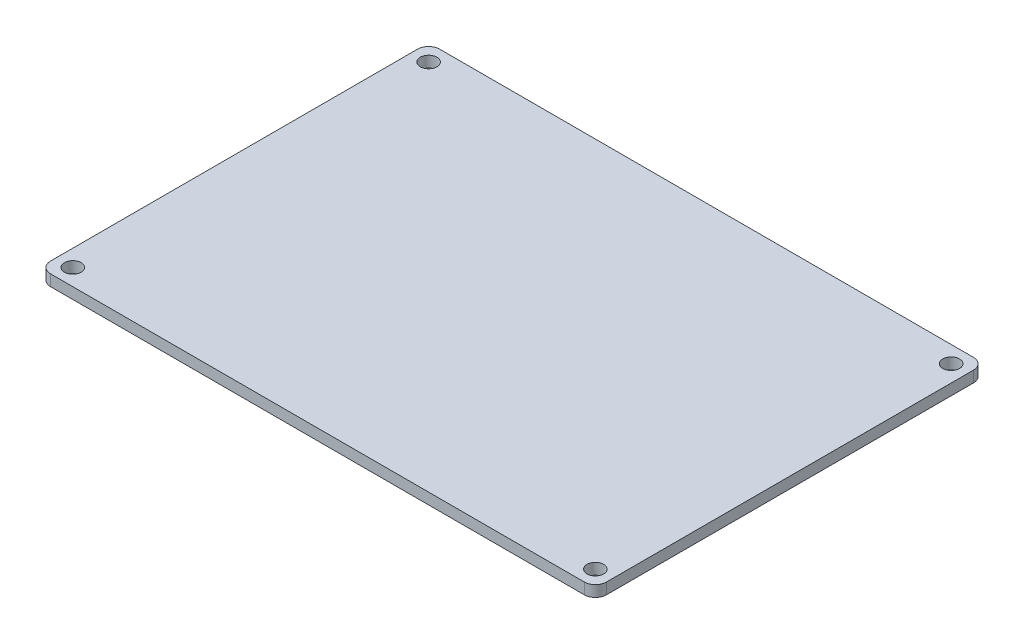
ISO-10303-21;
HEADER;
FILE_DESCRIPTION(('STEP AP214'),'2;1');
FILE_NAME('part.step','',(''),(''),'','','');
FILE_SCHEMA(('AUTOMOTIVE_DESIGN { 1 0 10303 214 1 1 1 1 }'));
ENDSEC;
DATA;
#1=APPLICATION_CONTEXT('core data for automotive mechanical design processes');
#2=APPLICATION_PROTOCOL_DEFINITION('international standard','automotive_design',2000,#1);
#3=PRODUCT_CONTEXT('',#1,'mechanical');
#4=PRODUCT('Part','Part','',(#3));
#5=PRODUCT_RELATED_PRODUCT_CATEGORY('part','',(#4));
#6=PRODUCT_DEFINITION_FORMATION('','',#4);
#7=PRODUCT_DEFINITION_CONTEXT('part definition',#1,'design');
#8=PRODUCT_DEFINITION('design','',#6,#7);
#9=PRODUCT_DEFINITION_SHAPE('','',#8);
#10=(LENGTH_UNIT() NAMED_UNIT(*) SI_UNIT(.MILLI.,.METRE.));
#11=(NAMED_UNIT(*) PLANE_ANGLE_UNIT() SI_UNIT($,.RADIAN.));
#12=(NAMED_UNIT(*) SI_UNIT($,.STERADIAN.) SOLID_ANGLE_UNIT());
#13=UNCERTAINTY_MEASURE_WITH_UNIT(LENGTH_MEASURE(1.E-05),#10,'distance_accuracy_value','');
#14=(GEOMETRIC_REPRESENTATION_CONTEXT(3) GLOBAL_UNCERTAINTY_ASSIGNED_CONTEXT((#13)) GLOBAL_UNIT_ASSIGNED_CONTEXT((#10,
#11,#12)) REPRESENTATION_CONTEXT('',''));
#15=CARTESIAN_POINT('',(0.,0.,0.));
#16=DIRECTION('',(0.,0.,1.));
#17=DIRECTION('',(1.,0.,0.));
#18=AXIS2_PLACEMENT_3D('',#15,#16,#17);
#19=CARTESIAN_POINT('',(48.,2.,-33.));
#20=DIRECTION('',(0.,1.,0.));
#21=DIRECTION('',(0.,0.,1.));
#22=AXIS2_PLACEMENT_3D('',#19,#20,#21);
#23=PLANE('',#22);
#24=CARTESIAN_POINT('',(47.,2.,32.));
#25=DIRECTION('',(0.,1.,0.));
#26=DIRECTION('',(0.,0.,1.));
#27=AXIS2_PLACEMENT_3D('',#24,#25,#26);
#28=CIRCLE('',#27,1.5);
#29=CARTESIAN_POINT('',(47.,2.,33.5));
#30=VERTEX_POINT('',#29);
#31=EDGE_CURVE('E202',#30,#30,#28,.T.);
#32=ORIENTED_EDGE('',*,*,#31,.F.);
#33=EDGE_LOOP('',(#32));
#34=FACE_BOUND('',#33,.T.);
#35=CARTESIAN_POINT('',(-47.,2.,-32.));
#36=DIRECTION('',(0.,1.,0.));
#37=DIRECTION('',(0.,0.,1.));
#38=AXIS2_PLACEMENT_3D('',#35,#36,#37);
#39=CIRCLE('',#38,1.5);
#40=CARTESIAN_POINT('',(-47.,2.,-30.5));
#41=VERTEX_POINT('',#40);
#42=EDGE_CURVE('E148',#41,#41,#39,.T.);
#43=ORIENTED_EDGE('',*,*,#42,.F.);
#44=EDGE_LOOP('',(#43));
#45=FACE_BOUND('',#44,.T.);
#46=CARTESIAN_POINT('',(48.,2.,-33.));
#47=DIRECTION('',(0.,1.,0.));
#48=DIRECTION('',(0.,0.,1.));
#49=AXIS2_PLACEMENT_3D('',#46,#47,#48);
#50=CIRCLE('',#49,2.);
#51=CARTESIAN_POINT('',(50.,2.,-33.));
#52=VERTEX_POINT('',#51);
#53=CARTESIAN_POINT('',(48.,2.,-35.));
#54=VERTEX_POINT('',#53);
#55=EDGE_CURVE('E159',#52,#54,#50,.T.);
#56=ORIENTED_EDGE('',*,*,#55,.T.);
#57=DIRECTION('',(-1.,0.,0.));
#58=VECTOR('',#57,1.);
#59=CARTESIAN_POINT('',(-48.,2.,-35.));
#60=LINE('',#59,#58);
#61=CARTESIAN_POINT('',(-48.,2.,-35.));
#62=VERTEX_POINT('',#61);
#63=EDGE_CURVE('E107',#54,#62,#60,.T.);
#64=ORIENTED_EDGE('',*,*,#63,.T.);
#65=CARTESIAN_POINT('',(-48.,2.,-33.));
#66=DIRECTION('',(0.,1.,0.));
#67=DIRECTION('',(0.,0.,-1.));
#68=AXIS2_PLACEMENT_3D('',#65,#66,#67);
#69=CIRCLE('',#68,2.);
#70=CARTESIAN_POINT('',(-50.,2.,-33.));
#71=VERTEX_POINT('',#70);
#72=EDGE_CURVE('E174',#62,#71,#69,.T.);
#73=ORIENTED_EDGE('',*,*,#72,.T.);
#74=DIRECTION('',(0.,0.,1.));
#75=VECTOR('',#74,1.);
#76=CARTESIAN_POINT('',(-50.,2.,-33.));
#77=LINE('',#76,#75);
#78=CARTESIAN_POINT('',(-50.,2.,33.));
#79=VERTEX_POINT('',#78);
#80=EDGE_CURVE('E187',#71,#79,#77,.T.);
#81=ORIENTED_EDGE('',*,*,#80,.T.);
#82=CARTESIAN_POINT('',(-48.,2.,33.));
#83=DIRECTION('',(0.,1.,0.));
#84=DIRECTION('',(0.,0.,1.));
#85=AXIS2_PLACEMENT_3D('',#82,#83,#84);
#86=CIRCLE('',#85,1.99999999999999);
#87=CARTESIAN_POINT('',(-48.,2.,35.));
#88=VERTEX_POINT('',#87);
#89=EDGE_CURVE('E126',#79,#88,#86,.T.);
#90=ORIENTED_EDGE('',*,*,#89,.T.);
#91=DIRECTION('',(1.,0.,0.));
#92=VECTOR('',#91,1.);
#93=CARTESIAN_POINT('',(-48.,2.,35.));
#94=LINE('',#93,#92);
#95=CARTESIAN_POINT('',(48.,2.,35.));
#96=VERTEX_POINT('',#95);
#97=EDGE_CURVE('E120',#88,#96,#94,.T.);
#98=ORIENTED_EDGE('',*,*,#97,.T.);
#99=CARTESIAN_POINT('',(48.,2.,33.));
#100=DIRECTION('',(0.,1.,0.));
#101=DIRECTION('',(0.,0.,1.));
#102=AXIS2_PLACEMENT_3D('',#99,#100,#101);
#103=CIRCLE('',#102,2.);
#104=CARTESIAN_POINT('',(50.,2.,33.));
#105=VERTEX_POINT('',#104);
#106=EDGE_CURVE('E124',#96,#105,#103,.T.);
#107=ORIENTED_EDGE('',*,*,#106,.T.);
#108=DIRECTION('',(0.,0.,-1.));
#109=VECTOR('',#108,1.);
#110=CARTESIAN_POINT('',(50.,2.,-33.));
#111=LINE('',#110,#109);
#112=EDGE_CURVE('E64',#105,#52,#111,.T.);
#113=ORIENTED_EDGE('',*,*,#112,.T.);
#114=EDGE_LOOP('',(#56,#64,#73,#81,#90,#98,#107,#113));
#115=FACE_BOUND('',#114,.T.);
#116=CARTESIAN_POINT('',(-47.,2.,32.));
#117=DIRECTION('',(0.,1.,0.));
#118=DIRECTION('',(0.,0.,-1.));
#119=AXIS2_PLACEMENT_3D('',#116,#117,#118);
#120=CIRCLE('',#119,1.5);
#121=CARTESIAN_POINT('',(-47.,2.,30.5));
#122=VERTEX_POINT('',#121);
#123=EDGE_CURVE('E196',#122,#122,#120,.T.);
#124=ORIENTED_EDGE('',*,*,#123,.F.);
#125=EDGE_LOOP('',(#124));
#126=FACE_BOUND('',#125,.T.);
#127=CARTESIAN_POINT('',(47.,2.,-32.));
#128=DIRECTION('',(0.,1.,0.));
#129=DIRECTION('',(0.,0.,-1.));
#130=AXIS2_PLACEMENT_3D('',#127,#128,#129);
#131=CIRCLE('',#130,1.5);
#132=CARTESIAN_POINT('',(47.,2.,-33.5));
#133=VERTEX_POINT('',#132);
#134=EDGE_CURVE('E208',#133,#133,#131,.T.);
#135=ORIENTED_EDGE('',*,*,#134,.F.);
#136=EDGE_LOOP('',(#135));
#137=FACE_BOUND('',#136,.T.);
#138=ADVANCED_FACE('F47',(#34,#45,#115,#126,#137),#23,.T.);
#139=CARTESIAN_POINT('',(48.,0.,-33.));
#140=DIRECTION('',(0.,1.,0.));
#141=DIRECTION('',(0.,0.,1.));
#142=AXIS2_PLACEMENT_3D('',#139,#140,#141);
#143=PLANE('',#142);
#144=CARTESIAN_POINT('',(48.,0.,-33.));
#145=DIRECTION('',(0.,1.,0.));
#146=DIRECTION('',(0.,0.,1.));
#147=AXIS2_PLACEMENT_3D('',#144,#145,#146);
#148=CIRCLE('',#147,2.);
#149=CARTESIAN_POINT('',(50.,0.,-33.));
#150=VERTEX_POINT('',#149);
#151=CARTESIAN_POINT('',(48.,0.,-35.));
#152=VERTEX_POINT('',#151);
#153=EDGE_CURVE('E144',#150,#152,#148,.T.);
#154=ORIENTED_EDGE('',*,*,#153,.F.);
#155=DIRECTION('',(0.,0.,-1.));
#156=VECTOR('',#155,1.);
#157=CARTESIAN_POINT('',(50.,0.,-33.));
#158=LINE('',#157,#156);
#159=CARTESIAN_POINT('',(50.,0.,33.));
#160=VERTEX_POINT('',#159);
#161=EDGE_CURVE('E99',#160,#150,#158,.T.);
#162=ORIENTED_EDGE('',*,*,#161,.F.);
#163=CARTESIAN_POINT('',(48.,0.,33.));
#164=DIRECTION('',(0.,1.,0.));
#165=DIRECTION('',(0.,0.,1.));
#166=AXIS2_PLACEMENT_3D('',#163,#164,#165);
#167=CIRCLE('',#166,2.);
#168=CARTESIAN_POINT('',(48.,0.,35.));
#169=VERTEX_POINT('',#168);
#170=EDGE_CURVE('E93',#169,#160,#167,.T.);
#171=ORIENTED_EDGE('',*,*,#170,.F.);
#172=DIRECTION('',(1.,0.,0.));
#173=VECTOR('',#172,1.);
#174=CARTESIAN_POINT('',(-48.,0.,35.));
#175=LINE('',#174,#173);
#176=CARTESIAN_POINT('',(-48.,0.,35.));
#177=VERTEX_POINT('',#176);
#178=EDGE_CURVE('E134',#177,#169,#175,.T.);
#179=ORIENTED_EDGE('',*,*,#178,.F.);
#180=CARTESIAN_POINT('',(-48.,0.,33.));
#181=DIRECTION('',(0.,1.,0.));
#182=DIRECTION('',(0.,0.,1.));
#183=AXIS2_PLACEMENT_3D('',#180,#181,#182);
#184=CIRCLE('',#183,1.99999999999999);
#185=CARTESIAN_POINT('',(-50.,0.,33.));
#186=VERTEX_POINT('',#185);
#187=EDGE_CURVE('E154',#186,#177,#184,.T.);
#188=ORIENTED_EDGE('',*,*,#187,.F.);
#189=DIRECTION('',(0.,0.,1.));
#190=VECTOR('',#189,1.);
#191=CARTESIAN_POINT('',(-50.,0.,-33.));
#192=LINE('',#191,#190);
#193=CARTESIAN_POINT('',(-50.,0.,-33.));
#194=VERTEX_POINT('',#193);
#195=EDGE_CURVE('E152',#194,#186,#192,.T.);
#196=ORIENTED_EDGE('',*,*,#195,.F.);
#197=CARTESIAN_POINT('',(-48.,0.,-33.));
#198=DIRECTION('',(0.,1.,0.));
#199=DIRECTION('',(0.,0.,-1.));
#200=AXIS2_PLACEMENT_3D('',#197,#198,#199);
#201=CIRCLE('',#200,2.);
#202=CARTESIAN_POINT('',(-48.,0.,-35.));
#203=VERTEX_POINT('',#202);
#204=EDGE_CURVE('E150',#203,#194,#201,.T.);
#205=ORIENTED_EDGE('',*,*,#204,.F.);
#206=DIRECTION('',(-1.,0.,0.));
#207=VECTOR('',#206,1.);
#208=CARTESIAN_POINT('',(-48.,0.,-35.));
#209=LINE('',#208,#207);
#210=EDGE_CURVE('E147',#152,#203,#209,.T.);
#211=ORIENTED_EDGE('',*,*,#210,.F.);
#212=EDGE_LOOP('',(#154,#162,#171,#179,#188,#196,#205,#211));
#213=FACE_BOUND('',#212,.T.);
#214=CARTESIAN_POINT('',(47.,0.,32.));
#215=DIRECTION('',(0.,1.,0.));
#216=DIRECTION('',(0.,0.,1.));
#217=AXIS2_PLACEMENT_3D('',#214,#215,#216);
#218=CIRCLE('',#217,1.5);
#219=CARTESIAN_POINT('',(47.,0.,33.5));
#220=VERTEX_POINT('',#219);
#221=EDGE_CURVE('E205',#220,#220,#218,.T.);
#222=ORIENTED_EDGE('',*,*,#221,.T.);
#223=EDGE_LOOP('',(#222));
#224=FACE_BOUND('',#223,.T.);
#225=CARTESIAN_POINT('',(47.,0.,-32.));
#226=DIRECTION('',(0.,1.,0.));
#227=DIRECTION('',(0.,0.,-1.));
#228=AXIS2_PLACEMENT_3D('',#225,#226,#227);
#229=CIRCLE('',#228,1.5);
#230=CARTESIAN_POINT('',(47.,0.,-33.5));
#231=VERTEX_POINT('',#230);
#232=EDGE_CURVE('E211',#231,#231,#229,.T.);
#233=ORIENTED_EDGE('',*,*,#232,.T.);
#234=EDGE_LOOP('',(#233));
#235=FACE_BOUND('',#234,.T.);
#236=CARTESIAN_POINT('',(-47.,0.,-32.));
#237=DIRECTION('',(0.,1.,0.));
#238=DIRECTION('',(0.,0.,1.));
#239=AXIS2_PLACEMENT_3D('',#236,#237,#238);
#240=CIRCLE('',#239,1.5);
#241=CARTESIAN_POINT('',(-47.,0.,-30.5));
#242=VERTEX_POINT('',#241);
#243=EDGE_CURVE('E193',#242,#242,#240,.T.);
#244=ORIENTED_EDGE('',*,*,#243,.T.);
#245=EDGE_LOOP('',(#244));
#246=FACE_BOUND('',#245,.T.);
#247=CARTESIAN_POINT('',(-47.,0.,32.));
#248=DIRECTION('',(0.,1.,0.));
#249=DIRECTION('',(0.,0.,-1.));
#250=AXIS2_PLACEMENT_3D('',#247,#248,#249);
#251=CIRCLE('',#250,1.5);
#252=CARTESIAN_POINT('',(-47.,0.,30.5));
#253=VERTEX_POINT('',#252);
#254=EDGE_CURVE('E199',#253,#253,#251,.T.);
#255=ORIENTED_EDGE('',*,*,#254,.T.);
#256=EDGE_LOOP('',(#255));
#257=FACE_BOUND('',#256,.T.);
#258=ADVANCED_FACE('F178',(#213,#224,#235,#246,#257),#143,.F.);
#259=CARTESIAN_POINT('',(48.,2.,-33.));
#260=DIRECTION('',(0.,-1.,0.));
#261=DIRECTION('',(0.,0.,-1.));
#262=AXIS2_PLACEMENT_3D('',#259,#260,#261);
#263=CYLINDRICAL_SURFACE('',#262,2.);
#264=ORIENTED_EDGE('',*,*,#153,.T.);
#265=DIRECTION('',(0.,-1.,0.));
#266=VECTOR('',#265,1.);
#267=CARTESIAN_POINT('',(48.,2.,-35.));
#268=LINE('',#267,#266);
#269=EDGE_CURVE('E11',#54,#152,#268,.T.);
#270=ORIENTED_EDGE('',*,*,#269,.F.);
#271=ORIENTED_EDGE('',*,*,#55,.F.);
#272=DIRECTION('',(0.,-1.,0.));
#273=VECTOR('',#272,1.);
#274=CARTESIAN_POINT('',(50.,2.,-33.));
#275=LINE('',#274,#273);
#276=EDGE_CURVE('E140',#52,#150,#275,.T.);
#277=ORIENTED_EDGE('',*,*,#276,.T.);
#278=EDGE_LOOP('',(#264,#270,#271,#277));
#279=FACE_BOUND('',#278,.T.);
#280=ADVANCED_FACE('F49',(#279),#263,.T.);
#281=CARTESIAN_POINT('',(-48.,2.,-35.));
#282=DIRECTION('',(0.,0.,1.));
#283=DIRECTION('',(1.,0.,0.));
#284=AXIS2_PLACEMENT_3D('',#281,#282,#283);
#285=PLANE('',#284);
#286=ORIENTED_EDGE('',*,*,#210,.T.);
#287=DIRECTION('',(0.,-1.,0.));
#288=VECTOR('',#287,1.);
#289=CARTESIAN_POINT('',(-48.,2.,-35.));
#290=LINE('',#289,#288);
#291=EDGE_CURVE('E56',#62,#203,#290,.T.);
#292=ORIENTED_EDGE('',*,*,#291,.F.);
#293=ORIENTED_EDGE('',*,*,#63,.F.);
#294=ORIENTED_EDGE('',*,*,#269,.T.);
#295=EDGE_LOOP('',(#286,#292,#293,#294));
#296=FACE_BOUND('',#295,.T.);
#297=ADVANCED_FACE('F246',(#296),#285,.F.);
#298=CARTESIAN_POINT('',(-48.,2.,-33.));
#299=DIRECTION('',(0.,-1.,0.));
#300=DIRECTION('',(0.,0.,-1.));
#301=AXIS2_PLACEMENT_3D('',#298,#299,#300);
#302=CYLINDRICAL_SURFACE('',#301,2.);
#303=ORIENTED_EDGE('',*,*,#204,.T.);
#304=DIRECTION('',(0.,-1.,0.));
#305=VECTOR('',#304,1.);
#306=CARTESIAN_POINT('',(-50.,2.,-33.));
#307=LINE('',#306,#305);
#308=EDGE_CURVE('E166',#71,#194,#307,.T.);
#309=ORIENTED_EDGE('',*,*,#308,.F.);
#310=ORIENTED_EDGE('',*,*,#72,.F.);
#311=ORIENTED_EDGE('',*,*,#291,.T.);
#312=EDGE_LOOP('',(#303,#309,#310,#311));
#313=FACE_BOUND('',#312,.T.);
#314=ADVANCED_FACE('F172',(#313),#302,.T.);
#315=CARTESIAN_POINT('',(-50.,2.,-33.));
#316=DIRECTION('',(1.,0.,0.));
#317=DIRECTION('',(0.,0.,-1.));
#318=AXIS2_PLACEMENT_3D('',#315,#316,#317);
#319=PLANE('',#318);
#320=ORIENTED_EDGE('',*,*,#195,.T.);
#321=DIRECTION('',(0.,-1.,0.));
#322=VECTOR('',#321,1.);
#323=CARTESIAN_POINT('',(-50.,2.,33.));
#324=LINE('',#323,#322);
#325=EDGE_CURVE('E163',#79,#186,#324,.T.);
#326=ORIENTED_EDGE('',*,*,#325,.F.);
#327=ORIENTED_EDGE('',*,*,#80,.F.);
#328=ORIENTED_EDGE('',*,*,#308,.T.);
#329=EDGE_LOOP('',(#320,#326,#327,#328));
#330=FACE_BOUND('',#329,.T.);
#331=ADVANCED_FACE('F183',(#330),#319,.F.);
#332=CARTESIAN_POINT('',(-48.,2.,33.));
#333=DIRECTION('',(0.,-1.,0.));
#334=DIRECTION('',(0.,0.,-1.));
#335=AXIS2_PLACEMENT_3D('',#332,#333,#334);
#336=CYLINDRICAL_SURFACE('',#335,1.99999999999999);
#337=ORIENTED_EDGE('',*,*,#187,.T.);
#338=DIRECTION('',(0.,-1.,0.));
#339=VECTOR('',#338,1.);
#340=CARTESIAN_POINT('',(-48.,2.,35.));
#341=LINE('',#340,#339);
#342=EDGE_CURVE('E135',#88,#177,#341,.T.);
#343=ORIENTED_EDGE('',*,*,#342,.F.);
#344=ORIENTED_EDGE('',*,*,#89,.F.);
#345=ORIENTED_EDGE('',*,*,#325,.T.);
#346=EDGE_LOOP('',(#337,#343,#344,#345));
#347=FACE_BOUND('',#346,.T.);
#348=ADVANCED_FACE('F186',(#347),#336,.T.);
#349=CARTESIAN_POINT('',(-48.,2.,35.));
#350=DIRECTION('',(0.,0.,-1.));
#351=DIRECTION('',(-1.,0.,0.));
#352=AXIS2_PLACEMENT_3D('',#349,#350,#351);
#353=PLANE('',#352);
#354=ORIENTED_EDGE('',*,*,#178,.T.);
#355=DIRECTION('',(0.,-1.,0.));
#356=VECTOR('',#355,1.);
#357=CARTESIAN_POINT('',(48.,2.,35.));
#358=LINE('',#357,#356);
#359=EDGE_CURVE('E131',#96,#169,#358,.T.);
#360=ORIENTED_EDGE('',*,*,#359,.F.);
#361=ORIENTED_EDGE('',*,*,#97,.F.);
#362=ORIENTED_EDGE('',*,*,#342,.T.);
#363=EDGE_LOOP('',(#354,#360,#361,#362));
#364=FACE_BOUND('',#363,.T.);
#365=ADVANCED_FACE('F132',(#364),#353,.F.);
#366=CARTESIAN_POINT('',(48.,2.,33.));
#367=DIRECTION('',(0.,-1.,0.));
#368=DIRECTION('',(0.,0.,-1.));
#369=AXIS2_PLACEMENT_3D('',#366,#367,#368);
#370=CYLINDRICAL_SURFACE('',#369,2.);
#371=ORIENTED_EDGE('',*,*,#170,.T.);
#372=DIRECTION('',(0.,-1.,0.));
#373=VECTOR('',#372,1.);
#374=CARTESIAN_POINT('',(50.,2.,33.));
#375=LINE('',#374,#373);
#376=EDGE_CURVE('E136',#105,#160,#375,.T.);
#377=ORIENTED_EDGE('',*,*,#376,.F.);
#378=ORIENTED_EDGE('',*,*,#106,.F.);
#379=ORIENTED_EDGE('',*,*,#359,.T.);
#380=EDGE_LOOP('',(#371,#377,#378,#379));
#381=FACE_BOUND('',#380,.T.);
#382=ADVANCED_FACE('F138',(#381),#370,.T.);
#383=CARTESIAN_POINT('',(50.,2.,-33.));
#384=DIRECTION('',(-1.,0.,0.));
#385=DIRECTION('',(0.,0.,1.));
#386=AXIS2_PLACEMENT_3D('',#383,#384,#385);
#387=PLANE('',#386);
#388=ORIENTED_EDGE('',*,*,#161,.T.);
#389=ORIENTED_EDGE('',*,*,#276,.F.);
#390=ORIENTED_EDGE('',*,*,#112,.F.);
#391=ORIENTED_EDGE('',*,*,#376,.T.);
#392=EDGE_LOOP('',(#388,#389,#390,#391));
#393=FACE_BOUND('',#392,.T.);
#394=ADVANCED_FACE('F234',(#393),#387,.F.);
#395=CARTESIAN_POINT('',(-47.,2.,-32.));
#396=DIRECTION('',(0.,-1.,0.));
#397=DIRECTION('',(0.,0.,-1.));
#398=AXIS2_PLACEMENT_3D('',#395,#396,#397);
#399=CYLINDRICAL_SURFACE('',#398,1.5);
#400=ORIENTED_EDGE('',*,*,#42,.T.);
#401=EDGE_LOOP('',(#400));
#402=FACE_BOUND('',#401,.T.);
#403=ORIENTED_EDGE('',*,*,#243,.F.);
#404=EDGE_LOOP('',(#403));
#405=FACE_BOUND('',#404,.T.);
#406=ADVANCED_FACE('F231',(#402,#405),#399,.F.);
#407=CARTESIAN_POINT('',(-47.,2.,32.));
#408=DIRECTION('',(0.,-1.,0.));
#409=DIRECTION('',(0.,0.,-1.));
#410=AXIS2_PLACEMENT_3D('',#407,#408,#409);
#411=CYLINDRICAL_SURFACE('',#410,1.5);
#412=ORIENTED_EDGE('',*,*,#123,.T.);
#413=EDGE_LOOP('',(#412));
#414=FACE_BOUND('',#413,.T.);
#415=ORIENTED_EDGE('',*,*,#254,.F.);
#416=EDGE_LOOP('',(#415));
#417=FACE_BOUND('',#416,.T.);
#418=ADVANCED_FACE('F309',(#414,#417),#411,.F.);
#419=CARTESIAN_POINT('',(47.,2.,32.));
#420=DIRECTION('',(0.,-1.,0.));
#421=DIRECTION('',(0.,0.,-1.));
#422=AXIS2_PLACEMENT_3D('',#419,#420,#421);
#423=CYLINDRICAL_SURFACE('',#422,1.5);
#424=ORIENTED_EDGE('',*,*,#31,.T.);
#425=EDGE_LOOP('',(#424));
#426=FACE_BOUND('',#425,.T.);
#427=ORIENTED_EDGE('',*,*,#221,.F.);
#428=EDGE_LOOP('',(#427));
#429=FACE_BOUND('',#428,.T.);
#430=ADVANCED_FACE('F318',(#426,#429),#423,.F.);
#431=CARTESIAN_POINT('',(47.,2.,-32.));
#432=DIRECTION('',(0.,-1.,0.));
#433=DIRECTION('',(0.,0.,-1.));
#434=AXIS2_PLACEMENT_3D('',#431,#432,#433);
#435=CYLINDRICAL_SURFACE('',#434,1.5);
#436=ORIENTED_EDGE('',*,*,#134,.T.);
#437=EDGE_LOOP('',(#436));
#438=FACE_BOUND('',#437,.T.);
#439=ORIENTED_EDGE('',*,*,#232,.F.);
#440=EDGE_LOOP('',(#439));
#441=FACE_BOUND('',#440,.T.);
#442=ADVANCED_FACE('F217',(#438,#441),#435,.F.);
#443=CLOSED_SHELL('',(#138,#258,#280,#297,#314,#331,#348,#365,#382,#394,#406,#418,#430,#442));
#444=MANIFOLD_SOLID_BREP('B2',#443);
#445=ADVANCED_BREP_SHAPE_REPRESENTATION('',(#18,#444),#14);
#446=SHAPE_DEFINITION_REPRESENTATION(#9,#445);
ENDSEC;
END-ISO-10303-21;
